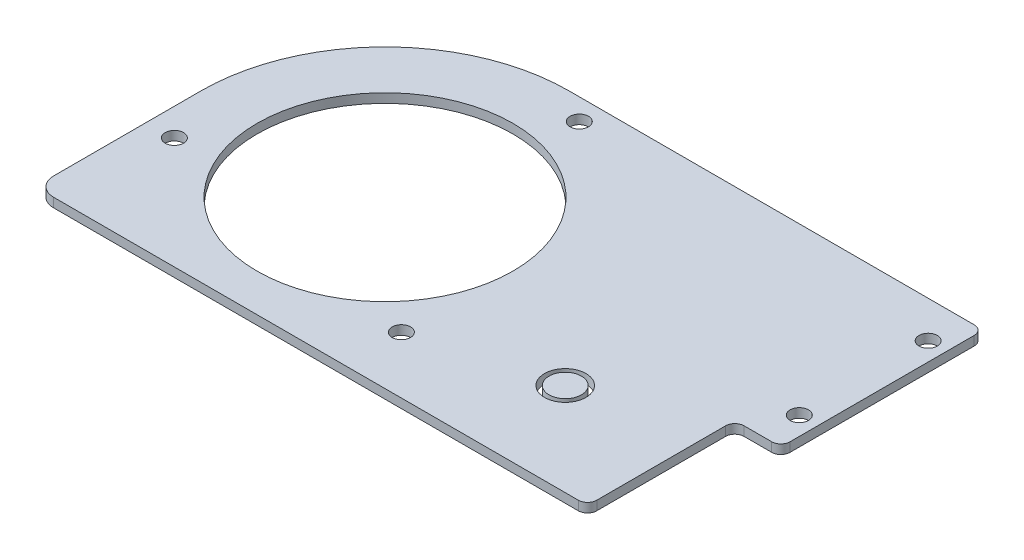
ISO-10303-21;
HEADER;
FILE_DESCRIPTION(('STEP AP214'),'2;1');
FILE_NAME('part.step','',(''),(''),'','','');
FILE_SCHEMA(('AUTOMOTIVE_DESIGN { 1 0 10303 214 1 1 1 1 }'));
ENDSEC;
DATA;
#1=APPLICATION_CONTEXT('core data for automotive mechanical design processes');
#2=APPLICATION_PROTOCOL_DEFINITION('international standard','automotive_design',2000,#1);
#3=PRODUCT_CONTEXT('',#1,'mechanical');
#4=PRODUCT('Part','Part','',(#3));
#5=PRODUCT_RELATED_PRODUCT_CATEGORY('part','',(#4));
#6=PRODUCT_DEFINITION_FORMATION('','',#4);
#7=PRODUCT_DEFINITION_CONTEXT('part definition',#1,'design');
#8=PRODUCT_DEFINITION('design','',#6,#7);
#9=PRODUCT_DEFINITION_SHAPE('','',#8);
#10=(LENGTH_UNIT() NAMED_UNIT(*) SI_UNIT(.MILLI.,.METRE.));
#11=(NAMED_UNIT(*) PLANE_ANGLE_UNIT() SI_UNIT($,.RADIAN.));
#12=(NAMED_UNIT(*) SI_UNIT($,.STERADIAN.) SOLID_ANGLE_UNIT());
#13=UNCERTAINTY_MEASURE_WITH_UNIT(LENGTH_MEASURE(1.E-05),#10,'distance_accuracy_value','');
#14=(GEOMETRIC_REPRESENTATION_CONTEXT(3) GLOBAL_UNCERTAINTY_ASSIGNED_CONTEXT((#13)) GLOBAL_UNIT_ASSIGNED_CONTEXT((#10,
#11,#12)) REPRESENTATION_CONTEXT('',''));
#15=CARTESIAN_POINT('',(0.,0.,0.));
#16=DIRECTION('',(0.,0.,1.));
#17=DIRECTION('',(1.,0.,0.));
#18=AXIS2_PLACEMENT_3D('',#15,#16,#17);
#19=CARTESIAN_POINT('',(-114.3,6.35,101.6));
#20=DIRECTION('',(0.,-1.,0.));
#21=DIRECTION('',(0.,0.,-1.));
#22=AXIS2_PLACEMENT_3D('',#19,#20,#21);
#23=PLANE('',#22);
#24=CARTESIAN_POINT('',(21.8094681715398,6.35,-112.199987068068));
#25=DIRECTION('',(0.,1.,0.));
#26=DIRECTION('',(0.,0.,1.));
#27=AXIS2_PLACEMENT_3D('',#24,#25,#26);
#28=CIRCLE('',#27,6.34999999999998);
#29=CARTESIAN_POINT('',(21.8094681715398,6.35,-105.849987068068));
#30=VERTEX_POINT('',#29);
#31=EDGE_CURVE('E191',#30,#30,#28,.T.);
#32=ORIENTED_EDGE('',*,*,#31,.F.);
#33=EDGE_LOOP('',(#32));
#34=FACE_BOUND('',#33,.T.);
#35=CARTESIAN_POINT('',(273.05,6.35,-101.6));
#36=DIRECTION('',(0.,1.,0.));
#37=DIRECTION('',(0.,0.,1.));
#38=AXIS2_PLACEMENT_3D('',#35,#36,#37);
#39=CIRCLE('',#38,6.35);
#40=CARTESIAN_POINT('',(273.05,6.35,-95.2500000000001));
#41=VERTEX_POINT('',#40);
#42=EDGE_CURVE('E179',#41,#41,#39,.T.);
#43=ORIENTED_EDGE('',*,*,#42,.F.);
#44=EDGE_LOOP('',(#43));
#45=FACE_BOUND('',#44,.T.);
#46=CARTESIAN_POINT('',(0.,6.35,0.));
#47=DIRECTION('',(0.,1.,0.));
#48=DIRECTION('',(0.,0.,1.));
#49=AXIS2_PLACEMENT_3D('',#46,#47,#48);
#50=CIRCLE('',#49,88.265);
#51=CARTESIAN_POINT('',(0.,6.35,88.265));
#52=VERTEX_POINT('',#51);
#53=EDGE_CURVE('E169',#52,#52,#50,.T.);
#54=ORIENTED_EDGE('',*,*,#53,.F.);
#55=EDGE_LOOP('',(#54));
#56=FACE_BOUND('',#55,.T.);
#57=CARTESIAN_POINT('',(-114.3,6.35,101.6));
#58=DIRECTION('',(0.,1.,0.));
#59=DIRECTION('',(0.,0.,-1.));
#60=AXIS2_PLACEMENT_3D('',#57,#58,#59);
#61=CIRCLE('',#60,12.7);
#62=CARTESIAN_POINT('',(-127.,6.35,101.6));
#63=VERTEX_POINT('',#62);
#64=CARTESIAN_POINT('',(-114.3,6.35,114.3));
#65=VERTEX_POINT('',#64);
#66=EDGE_CURVE('E139',#63,#65,#61,.T.);
#67=ORIENTED_EDGE('',*,*,#66,.T.);
#68=DIRECTION('',(1.,0.,0.));
#69=VECTOR('',#68,1.);
#70=CARTESIAN_POINT('',(247.65,6.35,114.3));
#71=LINE('',#70,#69);
#72=CARTESIAN_POINT('',(247.65,6.35,114.3));
#73=VERTEX_POINT('',#72);
#74=EDGE_CURVE('E132',#65,#73,#71,.T.);
#75=ORIENTED_EDGE('',*,*,#74,.T.);
#76=CARTESIAN_POINT('',(247.65,6.35,107.95));
#77=DIRECTION('',(0.,1.,0.));
#78=DIRECTION('',(0.,0.,1.));
#79=AXIS2_PLACEMENT_3D('',#76,#77,#78);
#80=CIRCLE('',#79,6.35000000000003);
#81=CARTESIAN_POINT('',(254.,6.35,107.95));
#82=VERTEX_POINT('',#81);
#83=EDGE_CURVE('E136',#73,#82,#80,.T.);
#84=ORIENTED_EDGE('',*,*,#83,.T.);
#85=DIRECTION('',(0.,0.,-1.));
#86=VECTOR('',#85,1.);
#87=CARTESIAN_POINT('',(254.,6.35,107.95));
#88=LINE('',#87,#86);
#89=CARTESIAN_POINT('',(254.,6.35,19.05));
#90=VERTEX_POINT('',#89);
#91=EDGE_CURVE('E157',#82,#90,#88,.T.);
#92=ORIENTED_EDGE('',*,*,#91,.T.);
#93=CARTESIAN_POINT('',(260.35,6.35,19.05));
#94=DIRECTION('',(0.,-1.,0.));
#95=DIRECTION('',(0.,0.,1.));
#96=AXIS2_PLACEMENT_3D('',#93,#94,#95);
#97=CIRCLE('',#96,6.35000000000001);
#98=CARTESIAN_POINT('',(260.35,6.35,12.7));
#99=VERTEX_POINT('',#98);
#100=EDGE_CURVE('E159',#90,#99,#97,.T.);
#101=ORIENTED_EDGE('',*,*,#100,.T.);
#102=DIRECTION('',(1.,0.,0.));
#103=VECTOR('',#102,1.);
#104=CARTESIAN_POINT('',(260.35,6.35,12.7));
#105=LINE('',#104,#103);
#106=CARTESIAN_POINT('',(279.4,6.35,12.7));
#107=VERTEX_POINT('',#106);
#108=EDGE_CURVE('E265',#99,#107,#105,.T.);
#109=ORIENTED_EDGE('',*,*,#108,.T.);
#110=CARTESIAN_POINT('',(279.4,6.35,6.35));
#111=DIRECTION('',(0.,1.,0.));
#112=DIRECTION('',(0.,0.,-1.));
#113=AXIS2_PLACEMENT_3D('',#110,#111,#112);
#114=CIRCLE('',#113,6.35000000000001);
#115=CARTESIAN_POINT('',(285.75,6.35,6.34999999999996));
#116=VERTEX_POINT('',#115);
#117=EDGE_CURVE('E263',#107,#116,#114,.T.);
#118=ORIENTED_EDGE('',*,*,#117,.T.);
#119=DIRECTION('',(0.,0.,-1.));
#120=VECTOR('',#119,1.);
#121=CARTESIAN_POINT('',(285.75,6.35,-120.65));
#122=LINE('',#121,#120);
#123=CARTESIAN_POINT('',(285.75,6.35,-120.65));
#124=VERTEX_POINT('',#123);
#125=EDGE_CURVE('E261',#116,#124,#122,.T.);
#126=ORIENTED_EDGE('',*,*,#125,.T.);
#127=CARTESIAN_POINT('',(279.4,6.35,-120.65));
#128=DIRECTION('',(0.,1.,0.));
#129=DIRECTION('',(0.,0.,-1.));
#130=AXIS2_PLACEMENT_3D('',#127,#128,#129);
#131=CIRCLE('',#130,6.35000000000001);
#132=CARTESIAN_POINT('',(279.4,6.35,-127.));
#133=VERTEX_POINT('',#132);
#134=EDGE_CURVE('E259',#124,#133,#131,.T.);
#135=ORIENTED_EDGE('',*,*,#134,.T.);
#136=DIRECTION('',(-1.,0.,0.));
#137=VECTOR('',#136,1.);
#138=CARTESIAN_POINT('',(279.4,6.35,-127.));
#139=LINE('',#138,#137);
#140=CARTESIAN_POINT('',(0.,6.35,-127.));
#141=VERTEX_POINT('',#140);
#142=EDGE_CURVE('E257',#133,#141,#139,.T.);
#143=ORIENTED_EDGE('',*,*,#142,.T.);
#144=CARTESIAN_POINT('',(0.,6.35,0.));
#145=DIRECTION('',(0.,1.,0.));
#146=DIRECTION('',(0.,0.,-1.));
#147=AXIS2_PLACEMENT_3D('',#144,#145,#146);
#148=CIRCLE('',#147,127.);
#149=CARTESIAN_POINT('',(-127.,6.35,0.));
#150=VERTEX_POINT('',#149);
#151=EDGE_CURVE('E255',#141,#150,#148,.T.);
#152=ORIENTED_EDGE('',*,*,#151,.T.);
#153=DIRECTION('',(0.,0.,1.));
#154=VECTOR('',#153,1.);
#155=CARTESIAN_POINT('',(-127.,6.35,0.));
#156=LINE('',#155,#154);
#157=EDGE_CURVE('E194',#150,#63,#156,.T.);
#158=ORIENTED_EDGE('',*,*,#157,.T.);
#159=EDGE_LOOP('',(#67,#75,#84,#92,#101,#109,#118,#126,#135,#143,#152,#158));
#160=FACE_BOUND('',#159,.T.);
#161=CARTESIAN_POINT('',(-108.072773191002,6.35,37.2124400544523));
#162=DIRECTION('',(0.,1.,0.));
#163=DIRECTION('',(0.,0.,1.));
#164=AXIS2_PLACEMENT_3D('',#161,#162,#163);
#165=CIRCLE('',#164,6.35);
#166=CARTESIAN_POINT('',(-108.072773191002,6.35,43.5624400544523));
#167=VERTEX_POINT('',#166);
#168=EDGE_CURVE('E172',#167,#167,#165,.T.);
#169=ORIENTED_EDGE('',*,*,#168,.F.);
#170=EDGE_LOOP('',(#169));
#171=FACE_BOUND('',#170,.T.);
#172=CARTESIAN_POINT('',(273.05,6.35,-12.7));
#173=DIRECTION('',(0.,1.,0.));
#174=DIRECTION('',(0.,0.,1.));
#175=AXIS2_PLACEMENT_3D('',#172,#173,#174);
#176=CIRCLE('',#175,6.35);
#177=CARTESIAN_POINT('',(273.05,6.35,-6.35));
#178=VERTEX_POINT('',#177);
#179=EDGE_CURVE('E185',#178,#178,#176,.T.);
#180=ORIENTED_EDGE('',*,*,#179,.F.);
#181=EDGE_LOOP('',(#180));
#182=FACE_BOUND('',#181,.T.);
#183=CARTESIAN_POINT('',(86.2633050194624,6.35,74.9875470136155));
#184=DIRECTION('',(0.,1.,0.));
#185=DIRECTION('',(0.,0.,1.));
#186=AXIS2_PLACEMENT_3D('',#183,#184,#185);
#187=CIRCLE('',#186,6.34999999999999);
#188=CARTESIAN_POINT('',(86.2633050194624,6.35,81.3375470136155));
#189=VERTEX_POINT('',#188);
#190=EDGE_CURVE('E55',#189,#189,#187,.T.);
#191=ORIENTED_EDGE('',*,*,#190,.F.);
#192=EDGE_LOOP('',(#191));
#193=FACE_BOUND('',#192,.T.);
#194=CARTESIAN_POINT('',(174.614839999995,6.35,50.2919999999997));
#195=DIRECTION('',(0.,-1.,0.));
#196=DIRECTION('',(0.,0.,-1.));
#197=AXIS2_PLACEMENT_3D('',#194,#195,#196);
#198=CIRCLE('',#197,14.2875);
#199=CARTESIAN_POINT('',(174.614839999995,6.35,36.0044999999997));
#200=VERTEX_POINT('',#199);
#201=EDGE_CURVE('E12',#200,#200,#198,.F.);
#202=ORIENTED_EDGE('',*,*,#201,.F.);
#203=EDGE_LOOP('',(#202));
#204=FACE_BOUND('',#203,.T.);
#205=ADVANCED_FACE('F46',(#34,#45,#56,#160,#171,#182,#193,#204),#23,.F.);
#206=CARTESIAN_POINT('',(-114.3,0.,101.6));
#207=DIRECTION('',(0.,-1.,0.));
#208=DIRECTION('',(0.,0.,-1.));
#209=AXIS2_PLACEMENT_3D('',#206,#207,#208);
#210=PLANE('',#209);
#211=CARTESIAN_POINT('',(21.8094681715398,0.,-112.199987068068));
#212=DIRECTION('',(0.,1.,0.));
#213=DIRECTION('',(0.,0.,1.));
#214=AXIS2_PLACEMENT_3D('',#211,#212,#213);
#215=CIRCLE('',#214,6.34999999999998);
#216=CARTESIAN_POINT('',(21.8094681715398,0.,-105.849987068068));
#217=VERTEX_POINT('',#216);
#218=EDGE_CURVE('E182',#217,#217,#215,.T.);
#219=ORIENTED_EDGE('',*,*,#218,.T.);
#220=EDGE_LOOP('',(#219));
#221=FACE_BOUND('',#220,.T.);
#222=CARTESIAN_POINT('',(273.05,0.,-101.6));
#223=DIRECTION('',(0.,1.,0.));
#224=DIRECTION('',(0.,0.,1.));
#225=AXIS2_PLACEMENT_3D('',#222,#223,#224);
#226=CIRCLE('',#225,6.35);
#227=CARTESIAN_POINT('',(273.05,0.,-95.2500000000001));
#228=VERTEX_POINT('',#227);
#229=EDGE_CURVE('E168',#228,#228,#226,.T.);
#230=ORIENTED_EDGE('',*,*,#229,.T.);
#231=EDGE_LOOP('',(#230));
#232=FACE_BOUND('',#231,.T.);
#233=CARTESIAN_POINT('',(0.,0.,0.));
#234=DIRECTION('',(0.,1.,0.));
#235=DIRECTION('',(0.,0.,1.));
#236=AXIS2_PLACEMENT_3D('',#233,#234,#235);
#237=CIRCLE('',#236,88.265);
#238=CARTESIAN_POINT('',(0.,0.,88.265));
#239=VERTEX_POINT('',#238);
#240=EDGE_CURVE('E164',#239,#239,#237,.T.);
#241=ORIENTED_EDGE('',*,*,#240,.T.);
#242=EDGE_LOOP('',(#241));
#243=FACE_BOUND('',#242,.T.);
#244=CARTESIAN_POINT('',(-114.3,0.,101.6));
#245=DIRECTION('',(0.,1.,0.));
#246=DIRECTION('',(0.,0.,-1.));
#247=AXIS2_PLACEMENT_3D('',#244,#245,#246);
#248=CIRCLE('',#247,12.7);
#249=CARTESIAN_POINT('',(-127.,0.,101.6));
#250=VERTEX_POINT('',#249);
#251=CARTESIAN_POINT('',(-114.3,0.,114.3));
#252=VERTEX_POINT('',#251);
#253=EDGE_CURVE('E240',#250,#252,#248,.T.);
#254=ORIENTED_EDGE('',*,*,#253,.F.);
#255=DIRECTION('',(0.,0.,1.));
#256=VECTOR('',#255,1.);
#257=CARTESIAN_POINT('',(-127.,0.,0.));
#258=LINE('',#257,#256);
#259=CARTESIAN_POINT('',(-127.,0.,0.));
#260=VERTEX_POINT('',#259);
#261=EDGE_CURVE('E63',#260,#250,#258,.T.);
#262=ORIENTED_EDGE('',*,*,#261,.F.);
#263=CARTESIAN_POINT('',(0.,0.,0.));
#264=DIRECTION('',(0.,1.,0.));
#265=DIRECTION('',(0.,0.,-1.));
#266=AXIS2_PLACEMENT_3D('',#263,#264,#265);
#267=CIRCLE('',#266,127.);
#268=CARTESIAN_POINT('',(0.,0.,-127.));
#269=VERTEX_POINT('',#268);
#270=EDGE_CURVE('E315',#269,#260,#267,.T.);
#271=ORIENTED_EDGE('',*,*,#270,.F.);
#272=DIRECTION('',(-1.,0.,0.));
#273=VECTOR('',#272,1.);
#274=CARTESIAN_POINT('',(279.4,0.,-127.));
#275=LINE('',#274,#273);
#276=CARTESIAN_POINT('',(279.4,0.,-127.));
#277=VERTEX_POINT('',#276);
#278=EDGE_CURVE('E306',#277,#269,#275,.T.);
#279=ORIENTED_EDGE('',*,*,#278,.F.);
#280=CARTESIAN_POINT('',(279.4,0.,-120.65));
#281=DIRECTION('',(0.,1.,0.));
#282=DIRECTION('',(0.,0.,-1.));
#283=AXIS2_PLACEMENT_3D('',#280,#281,#282);
#284=CIRCLE('',#283,6.35000000000001);
#285=CARTESIAN_POINT('',(285.75,0.,-120.65));
#286=VERTEX_POINT('',#285);
#287=EDGE_CURVE('E307',#286,#277,#284,.T.);
#288=ORIENTED_EDGE('',*,*,#287,.F.);
#289=DIRECTION('',(0.,0.,-1.));
#290=VECTOR('',#289,1.);
#291=CARTESIAN_POINT('',(285.75,0.,-120.65));
#292=LINE('',#291,#290);
#293=CARTESIAN_POINT('',(285.75,0.,6.34999999999996));
#294=VERTEX_POINT('',#293);
#295=EDGE_CURVE('E289',#294,#286,#292,.T.);
#296=ORIENTED_EDGE('',*,*,#295,.F.);
#297=CARTESIAN_POINT('',(279.4,0.,6.35));
#298=DIRECTION('',(0.,1.,0.));
#299=DIRECTION('',(0.,0.,-1.));
#300=AXIS2_PLACEMENT_3D('',#297,#298,#299);
#301=CIRCLE('',#300,6.35000000000001);
#302=CARTESIAN_POINT('',(279.4,0.,12.7));
#303=VERTEX_POINT('',#302);
#304=EDGE_CURVE('E280',#303,#294,#301,.T.);
#305=ORIENTED_EDGE('',*,*,#304,.F.);
#306=DIRECTION('',(1.,0.,0.));
#307=VECTOR('',#306,1.);
#308=CARTESIAN_POINT('',(260.35,0.,12.7));
#309=LINE('',#308,#307);
#310=CARTESIAN_POINT('',(260.35,0.,12.7));
#311=VERTEX_POINT('',#310);
#312=EDGE_CURVE('E281',#311,#303,#309,.T.);
#313=ORIENTED_EDGE('',*,*,#312,.F.);
#314=CARTESIAN_POINT('',(260.35,0.,19.05));
#315=DIRECTION('',(0.,-1.,0.));
#316=DIRECTION('',(0.,0.,1.));
#317=AXIS2_PLACEMENT_3D('',#314,#315,#316);
#318=CIRCLE('',#317,6.35000000000001);
#319=CARTESIAN_POINT('',(254.,0.,19.05));
#320=VERTEX_POINT('',#319);
#321=EDGE_CURVE('E277',#320,#311,#318,.T.);
#322=ORIENTED_EDGE('',*,*,#321,.F.);
#323=DIRECTION('',(0.,0.,-1.));
#324=VECTOR('',#323,1.);
#325=CARTESIAN_POINT('',(254.,0.,107.95));
#326=LINE('',#325,#324);
#327=CARTESIAN_POINT('',(254.,0.,107.95));
#328=VERTEX_POINT('',#327);
#329=EDGE_CURVE('E150',#328,#320,#326,.T.);
#330=ORIENTED_EDGE('',*,*,#329,.F.);
#331=CARTESIAN_POINT('',(247.65,0.,107.95));
#332=DIRECTION('',(0.,1.,0.));
#333=DIRECTION('',(0.,0.,1.));
#334=AXIS2_PLACEMENT_3D('',#331,#332,#333);
#335=CIRCLE('',#334,6.35000000000003);
#336=CARTESIAN_POINT('',(247.65,0.,114.3));
#337=VERTEX_POINT('',#336);
#338=EDGE_CURVE('E151',#337,#328,#335,.T.);
#339=ORIENTED_EDGE('',*,*,#338,.F.);
#340=DIRECTION('',(1.,0.,0.));
#341=VECTOR('',#340,1.);
#342=CARTESIAN_POINT('',(247.65,0.,114.3));
#343=LINE('',#342,#341);
#344=EDGE_CURVE('E147',#252,#337,#343,.T.);
#345=ORIENTED_EDGE('',*,*,#344,.F.);
#346=EDGE_LOOP('',(#254,#262,#271,#279,#288,#296,#305,#313,#322,#330,#339,#345));
#347=FACE_BOUND('',#346,.T.);
#348=CARTESIAN_POINT('',(-108.072773191002,0.,37.2124400544523));
#349=DIRECTION('',(0.,1.,0.));
#350=DIRECTION('',(0.,0.,1.));
#351=AXIS2_PLACEMENT_3D('',#348,#349,#350);
#352=CIRCLE('',#351,6.35);
#353=CARTESIAN_POINT('',(-108.072773191002,0.,43.5624400544523));
#354=VERTEX_POINT('',#353);
#355=EDGE_CURVE('E167',#354,#354,#352,.T.);
#356=ORIENTED_EDGE('',*,*,#355,.T.);
#357=EDGE_LOOP('',(#356));
#358=FACE_BOUND('',#357,.T.);
#359=CARTESIAN_POINT('',(273.05,0.,-12.7));
#360=DIRECTION('',(0.,1.,0.));
#361=DIRECTION('',(0.,0.,1.));
#362=AXIS2_PLACEMENT_3D('',#359,#360,#361);
#363=CIRCLE('',#362,6.35);
#364=CARTESIAN_POINT('',(273.05,0.,-6.35));
#365=VERTEX_POINT('',#364);
#366=EDGE_CURVE('E176',#365,#365,#363,.T.);
#367=ORIENTED_EDGE('',*,*,#366,.T.);
#368=EDGE_LOOP('',(#367));
#369=FACE_BOUND('',#368,.T.);
#370=CARTESIAN_POINT('',(86.2633050194624,0.,74.9875470136155));
#371=DIRECTION('',(0.,1.,0.));
#372=DIRECTION('',(0.,0.,1.));
#373=AXIS2_PLACEMENT_3D('',#370,#371,#372);
#374=CIRCLE('',#373,6.34999999999999);
#375=CARTESIAN_POINT('',(86.2633050194624,0.,81.3375470136155));
#376=VERTEX_POINT('',#375);
#377=EDGE_CURVE('E188',#376,#376,#374,.T.);
#378=ORIENTED_EDGE('',*,*,#377,.T.);
#379=EDGE_LOOP('',(#378));
#380=FACE_BOUND('',#379,.T.);
#381=CARTESIAN_POINT('',(174.614839999995,0.,50.2919999999997));
#382=DIRECTION('',(0.,1.,0.));
#383=DIRECTION('',(0.,0.,1.));
#384=AXIS2_PLACEMENT_3D('',#381,#382,#383);
#385=CIRCLE('',#384,14.2875);
#386=CARTESIAN_POINT('',(174.614839999995,0.,64.5794999999998));
#387=VERTEX_POINT('',#386);
#388=EDGE_CURVE('E49',#387,#387,#385,.T.);
#389=ORIENTED_EDGE('',*,*,#388,.T.);
#390=EDGE_LOOP('',(#389));
#391=FACE_BOUND('',#390,.T.);
#392=ADVANCED_FACE('F207',(#221,#232,#243,#347,#358,#369,#380,#391),#210,.T.);
#393=CARTESIAN_POINT('',(-114.3,6.35,101.6));
#394=DIRECTION('',(0.,-1.,0.));
#395=DIRECTION('',(0.,0.,-1.));
#396=AXIS2_PLACEMENT_3D('',#393,#394,#395);
#397=CYLINDRICAL_SURFACE('',#396,12.7);
#398=ORIENTED_EDGE('',*,*,#253,.T.);
#399=DIRECTION('',(0.,-1.,0.));
#400=VECTOR('',#399,1.);
#401=CARTESIAN_POINT('',(-114.3,6.35,114.3));
#402=LINE('',#401,#400);
#403=EDGE_CURVE('E329',#65,#252,#402,.T.);
#404=ORIENTED_EDGE('',*,*,#403,.F.);
#405=ORIENTED_EDGE('',*,*,#66,.F.);
#406=DIRECTION('',(0.,-1.,0.));
#407=VECTOR('',#406,1.);
#408=CARTESIAN_POINT('',(-127.,6.35,101.6));
#409=LINE('',#408,#407);
#410=EDGE_CURVE('E248',#63,#250,#409,.T.);
#411=ORIENTED_EDGE('',*,*,#410,.T.);
#412=EDGE_LOOP('',(#398,#404,#405,#411));
#413=FACE_BOUND('',#412,.T.);
#414=ADVANCED_FACE('F224',(#413),#397,.T.);
#415=CARTESIAN_POINT('',(247.65,6.35,114.3));
#416=DIRECTION('',(0.,0.,-1.));
#417=DIRECTION('',(-1.,0.,0.));
#418=AXIS2_PLACEMENT_3D('',#415,#416,#417);
#419=PLANE('',#418);
#420=ORIENTED_EDGE('',*,*,#344,.T.);
#421=DIRECTION('',(0.,-1.,0.));
#422=VECTOR('',#421,1.);
#423=CARTESIAN_POINT('',(247.65,6.35,114.3));
#424=LINE('',#423,#422);
#425=EDGE_CURVE('E145',#73,#337,#424,.T.);
#426=ORIENTED_EDGE('',*,*,#425,.F.);
#427=ORIENTED_EDGE('',*,*,#74,.F.);
#428=ORIENTED_EDGE('',*,*,#403,.T.);
#429=EDGE_LOOP('',(#420,#426,#427,#428));
#430=FACE_BOUND('',#429,.T.);
#431=ADVANCED_FACE('F146',(#430),#419,.F.);
#432=CARTESIAN_POINT('',(247.65,6.35,107.95));
#433=DIRECTION('',(0.,-1.,0.));
#434=DIRECTION('',(0.,0.,-1.));
#435=AXIS2_PLACEMENT_3D('',#432,#433,#434);
#436=CYLINDRICAL_SURFACE('',#435,6.35000000000003);
#437=ORIENTED_EDGE('',*,*,#338,.T.);
#438=DIRECTION('',(0.,-1.,0.));
#439=VECTOR('',#438,1.);
#440=CARTESIAN_POINT('',(254.,6.35,107.95));
#441=LINE('',#440,#439);
#442=EDGE_CURVE('E155',#82,#328,#441,.T.);
#443=ORIENTED_EDGE('',*,*,#442,.F.);
#444=ORIENTED_EDGE('',*,*,#83,.F.);
#445=ORIENTED_EDGE('',*,*,#425,.T.);
#446=EDGE_LOOP('',(#437,#443,#444,#445));
#447=FACE_BOUND('',#446,.T.);
#448=ADVANCED_FACE('F153',(#447),#436,.T.);
#449=CARTESIAN_POINT('',(254.,6.35,107.95));
#450=DIRECTION('',(-1.,0.,0.));
#451=DIRECTION('',(0.,0.,1.));
#452=AXIS2_PLACEMENT_3D('',#449,#450,#451);
#453=PLANE('',#452);
#454=ORIENTED_EDGE('',*,*,#329,.T.);
#455=DIRECTION('',(0.,-1.,0.));
#456=VECTOR('',#455,1.);
#457=CARTESIAN_POINT('',(254.,6.35,19.05));
#458=LINE('',#457,#456);
#459=EDGE_CURVE('E333',#90,#320,#458,.T.);
#460=ORIENTED_EDGE('',*,*,#459,.F.);
#461=ORIENTED_EDGE('',*,*,#91,.F.);
#462=ORIENTED_EDGE('',*,*,#442,.T.);
#463=EDGE_LOOP('',(#454,#460,#461,#462));
#464=FACE_BOUND('',#463,.T.);
#465=ADVANCED_FACE('F347',(#464),#453,.F.);
#466=CARTESIAN_POINT('',(260.35,6.35,19.05));
#467=DIRECTION('',(0.,-1.,0.));
#468=DIRECTION('',(0.,0.,-1.));
#469=AXIS2_PLACEMENT_3D('',#466,#467,#468);
#470=CYLINDRICAL_SURFACE('',#469,6.35000000000001);
#471=ORIENTED_EDGE('',*,*,#321,.T.);
#472=DIRECTION('',(0.,-1.,0.));
#473=VECTOR('',#472,1.);
#474=CARTESIAN_POINT('',(260.35,6.35,12.7));
#475=LINE('',#474,#473);
#476=EDGE_CURVE('E274',#99,#311,#475,.T.);
#477=ORIENTED_EDGE('',*,*,#476,.F.);
#478=ORIENTED_EDGE('',*,*,#100,.F.);
#479=ORIENTED_EDGE('',*,*,#459,.T.);
#480=EDGE_LOOP('',(#471,#477,#478,#479));
#481=FACE_BOUND('',#480,.T.);
#482=ADVANCED_FACE('F275',(#481),#470,.F.);
#483=CARTESIAN_POINT('',(260.35,6.35,12.7));
#484=DIRECTION('',(0.,0.,-1.));
#485=DIRECTION('',(-1.,0.,0.));
#486=AXIS2_PLACEMENT_3D('',#483,#484,#485);
#487=PLANE('',#486);
#488=ORIENTED_EDGE('',*,*,#312,.T.);
#489=DIRECTION('',(0.,-1.,0.));
#490=VECTOR('',#489,1.);
#491=CARTESIAN_POINT('',(279.4,6.35,12.7));
#492=LINE('',#491,#490);
#493=EDGE_CURVE('E285',#107,#303,#492,.T.);
#494=ORIENTED_EDGE('',*,*,#493,.F.);
#495=ORIENTED_EDGE('',*,*,#108,.F.);
#496=ORIENTED_EDGE('',*,*,#476,.T.);
#497=EDGE_LOOP('',(#488,#494,#495,#496));
#498=FACE_BOUND('',#497,.T.);
#499=ADVANCED_FACE('F283',(#498),#487,.F.);
#500=CARTESIAN_POINT('',(279.4,6.35,6.35));
#501=DIRECTION('',(0.,-1.,0.));
#502=DIRECTION('',(0.,0.,-1.));
#503=AXIS2_PLACEMENT_3D('',#500,#501,#502);
#504=CYLINDRICAL_SURFACE('',#503,6.35000000000001);
#505=ORIENTED_EDGE('',*,*,#304,.T.);
#506=DIRECTION('',(0.,-1.,0.));
#507=VECTOR('',#506,1.);
#508=CARTESIAN_POINT('',(285.75,6.35,6.34999999999996));
#509=LINE('',#508,#507);
#510=EDGE_CURVE('E294',#116,#294,#509,.T.);
#511=ORIENTED_EDGE('',*,*,#510,.F.);
#512=ORIENTED_EDGE('',*,*,#117,.F.);
#513=ORIENTED_EDGE('',*,*,#493,.T.);
#514=EDGE_LOOP('',(#505,#511,#512,#513));
#515=FACE_BOUND('',#514,.T.);
#516=ADVANCED_FACE('F292',(#515),#504,.T.);
#517=CARTESIAN_POINT('',(285.75,6.35,-120.65));
#518=DIRECTION('',(-1.,0.,0.));
#519=DIRECTION('',(0.,0.,1.));
#520=AXIS2_PLACEMENT_3D('',#517,#518,#519);
#521=PLANE('',#520);
#522=ORIENTED_EDGE('',*,*,#295,.T.);
#523=DIRECTION('',(0.,-1.,0.));
#524=VECTOR('',#523,1.);
#525=CARTESIAN_POINT('',(285.75,6.35,-120.65));
#526=LINE('',#525,#524);
#527=EDGE_CURVE('E301',#124,#286,#526,.T.);
#528=ORIENTED_EDGE('',*,*,#527,.F.);
#529=ORIENTED_EDGE('',*,*,#125,.F.);
#530=ORIENTED_EDGE('',*,*,#510,.T.);
#531=EDGE_LOOP('',(#522,#528,#529,#530));
#532=FACE_BOUND('',#531,.T.);
#533=ADVANCED_FACE('F302',(#532),#521,.F.);
#534=CARTESIAN_POINT('',(279.4,6.35,-120.65));
#535=DIRECTION('',(0.,-1.,0.));
#536=DIRECTION('',(0.,0.,-1.));
#537=AXIS2_PLACEMENT_3D('',#534,#535,#536);
#538=CYLINDRICAL_SURFACE('',#537,6.35000000000001);
#539=ORIENTED_EDGE('',*,*,#287,.T.);
#540=DIRECTION('',(0.,-1.,0.));
#541=VECTOR('',#540,1.);
#542=CARTESIAN_POINT('',(279.4,6.35,-127.));
#543=LINE('',#542,#541);
#544=EDGE_CURVE('E311',#133,#277,#543,.T.);
#545=ORIENTED_EDGE('',*,*,#544,.F.);
#546=ORIENTED_EDGE('',*,*,#134,.F.);
#547=ORIENTED_EDGE('',*,*,#527,.T.);
#548=EDGE_LOOP('',(#539,#545,#546,#547));
#549=FACE_BOUND('',#548,.T.);
#550=ADVANCED_FACE('F309',(#549),#538,.T.);
#551=CARTESIAN_POINT('',(279.4,6.35,-127.));
#552=DIRECTION('',(0.,0.,1.));
#553=DIRECTION('',(1.,0.,0.));
#554=AXIS2_PLACEMENT_3D('',#551,#552,#553);
#555=PLANE('',#554);
#556=ORIENTED_EDGE('',*,*,#278,.T.);
#557=DIRECTION('',(0.,-1.,0.));
#558=VECTOR('',#557,1.);
#559=CARTESIAN_POINT('',(0.,6.35,-127.));
#560=LINE('',#559,#558);
#561=EDGE_CURVE('E320',#141,#269,#560,.T.);
#562=ORIENTED_EDGE('',*,*,#561,.F.);
#563=ORIENTED_EDGE('',*,*,#142,.F.);
#564=ORIENTED_EDGE('',*,*,#544,.T.);
#565=EDGE_LOOP('',(#556,#562,#563,#564));
#566=FACE_BOUND('',#565,.T.);
#567=ADVANCED_FACE('F318',(#566),#555,.F.);
#568=CARTESIAN_POINT('',(0.,6.35,0.));
#569=DIRECTION('',(0.,-1.,0.));
#570=DIRECTION('',(0.,0.,-1.));
#571=AXIS2_PLACEMENT_3D('',#568,#569,#570);
#572=CYLINDRICAL_SURFACE('',#571,127.);
#573=ORIENTED_EDGE('',*,*,#270,.T.);
#574=DIRECTION('',(0.,-1.,0.));
#575=VECTOR('',#574,1.);
#576=CARTESIAN_POINT('',(-127.,6.35,0.));
#577=LINE('',#576,#575);
#578=EDGE_CURVE('E173',#150,#260,#577,.T.);
#579=ORIENTED_EDGE('',*,*,#578,.F.);
#580=ORIENTED_EDGE('',*,*,#151,.F.);
#581=ORIENTED_EDGE('',*,*,#561,.T.);
#582=EDGE_LOOP('',(#573,#579,#580,#581));
#583=FACE_BOUND('',#582,.T.);
#584=ADVANCED_FACE('F325',(#583),#572,.T.);
#585=CARTESIAN_POINT('',(-127.,6.35,0.));
#586=DIRECTION('',(1.,0.,0.));
#587=DIRECTION('',(0.,0.,-1.));
#588=AXIS2_PLACEMENT_3D('',#585,#586,#587);
#589=PLANE('',#588);
#590=ORIENTED_EDGE('',*,*,#261,.T.);
#591=ORIENTED_EDGE('',*,*,#410,.F.);
#592=ORIENTED_EDGE('',*,*,#157,.F.);
#593=ORIENTED_EDGE('',*,*,#578,.T.);
#594=EDGE_LOOP('',(#590,#591,#592,#593));
#595=FACE_BOUND('',#594,.T.);
#596=ADVANCED_FACE('F328',(#595),#589,.F.);
#597=CARTESIAN_POINT('',(0.,6.35,0.));
#598=DIRECTION('',(0.,-1.,0.));
#599=DIRECTION('',(0.,0.,-1.));
#600=AXIS2_PLACEMENT_3D('',#597,#598,#599);
#601=CYLINDRICAL_SURFACE('',#600,88.265);
#602=ORIENTED_EDGE('',*,*,#53,.T.);
#603=EDGE_LOOP('',(#602));
#604=FACE_BOUND('',#603,.T.);
#605=ORIENTED_EDGE('',*,*,#240,.F.);
#606=EDGE_LOOP('',(#605));
#607=FACE_BOUND('',#606,.T.);
#608=ADVANCED_FACE('F372',(#604,#607),#601,.F.);
#609=CARTESIAN_POINT('',(-108.072773191002,6.35,37.2124400544523));
#610=DIRECTION('',(0.,-1.,0.));
#611=DIRECTION('',(0.,0.,-1.));
#612=AXIS2_PLACEMENT_3D('',#609,#610,#611);
#613=CYLINDRICAL_SURFACE('',#612,6.35);
#614=ORIENTED_EDGE('',*,*,#168,.T.);
#615=EDGE_LOOP('',(#614));
#616=FACE_BOUND('',#615,.T.);
#617=ORIENTED_EDGE('',*,*,#355,.F.);
#618=EDGE_LOOP('',(#617));
#619=FACE_BOUND('',#618,.T.);
#620=ADVANCED_FACE('F375',(#616,#619),#613,.F.);
#621=CARTESIAN_POINT('',(273.05,6.35,-101.6));
#622=DIRECTION('',(0.,-1.,0.));
#623=DIRECTION('',(0.,0.,-1.));
#624=AXIS2_PLACEMENT_3D('',#621,#622,#623);
#625=CYLINDRICAL_SURFACE('',#624,6.35);
#626=ORIENTED_EDGE('',*,*,#42,.T.);
#627=EDGE_LOOP('',(#626));
#628=FACE_BOUND('',#627,.T.);
#629=ORIENTED_EDGE('',*,*,#229,.F.);
#630=EDGE_LOOP('',(#629));
#631=FACE_BOUND('',#630,.T.);
#632=ADVANCED_FACE('F379',(#628,#631),#625,.F.);
#633=CARTESIAN_POINT('',(273.05,6.35,-12.7));
#634=DIRECTION('',(0.,-1.,0.));
#635=DIRECTION('',(0.,0.,-1.));
#636=AXIS2_PLACEMENT_3D('',#633,#634,#635);
#637=CYLINDRICAL_SURFACE('',#636,6.35);
#638=ORIENTED_EDGE('',*,*,#179,.T.);
#639=EDGE_LOOP('',(#638));
#640=FACE_BOUND('',#639,.T.);
#641=ORIENTED_EDGE('',*,*,#366,.F.);
#642=EDGE_LOOP('',(#641));
#643=FACE_BOUND('',#642,.T.);
#644=ADVANCED_FACE('F383',(#640,#643),#637,.F.);
#645=CARTESIAN_POINT('',(21.8094681715398,6.35,-112.199987068068));
#646=DIRECTION('',(0.,-1.,0.));
#647=DIRECTION('',(0.,0.,-1.));
#648=AXIS2_PLACEMENT_3D('',#645,#646,#647);
#649=CYLINDRICAL_SURFACE('',#648,6.34999999999998);
#650=ORIENTED_EDGE('',*,*,#31,.T.);
#651=EDGE_LOOP('',(#650));
#652=FACE_BOUND('',#651,.T.);
#653=ORIENTED_EDGE('',*,*,#218,.F.);
#654=EDGE_LOOP('',(#653));
#655=FACE_BOUND('',#654,.T.);
#656=ADVANCED_FACE('F219',(#652,#655),#649,.F.);
#657=CARTESIAN_POINT('',(86.2633050194624,6.35,74.9875470136155));
#658=DIRECTION('',(0.,-1.,0.));
#659=DIRECTION('',(0.,0.,-1.));
#660=AXIS2_PLACEMENT_3D('',#657,#658,#659);
#661=CYLINDRICAL_SURFACE('',#660,6.34999999999999);
#662=ORIENTED_EDGE('',*,*,#190,.T.);
#663=EDGE_LOOP('',(#662));
#664=FACE_BOUND('',#663,.T.);
#665=ORIENTED_EDGE('',*,*,#377,.F.);
#666=EDGE_LOOP('',(#665));
#667=FACE_BOUND('',#666,.T.);
#668=ADVANCED_FACE('F202',(#664,#667),#661,.F.);
#669=CARTESIAN_POINT('',(174.614839999995,28.448,50.2919999999997));
#670=DIRECTION('',(0.,-1.,0.));
#671=DIRECTION('',(0.,0.,-1.));
#672=AXIS2_PLACEMENT_3D('',#669,#670,#671);
#673=CYLINDRICAL_SURFACE('',#672,14.2875);
#674=ORIENTED_EDGE('',*,*,#388,.F.);
#675=EDGE_LOOP('',(#674));
#676=FACE_BOUND('',#675,.T.);
#677=ORIENTED_EDGE('',*,*,#201,.T.);
#678=EDGE_LOOP('',(#677));
#679=FACE_BOUND('',#678,.T.);
#680=ADVANCED_FACE('F211',(#676,#679),#673,.F.);
#681=CLOSED_SHELL('',(#205,#392,#414,#431,#448,#465,#482,#499,#516,#533,#550,#567,#584,#596,
#608,#620,#632,#644,#656,#668,#680));
#682=MANIFOLD_SOLID_BREP('B2',#681);
#683=CARTESIAN_POINT('',(-114.3,0.,101.6));
#684=DIRECTION('',(0.,-1.,0.));
#685=DIRECTION('',(0.,0.,-1.));
#686=AXIS2_PLACEMENT_3D('',#683,#684,#685);
#687=PLANE('',#686);
#688=CARTESIAN_POINT('',(174.614839999995,0.,50.2919999999997));
#689=DIRECTION('',(0.,1.,0.));
#690=DIRECTION('',(0.,0.,1.));
#691=AXIS2_PLACEMENT_3D('',#688,#689,#690);
#692=CIRCLE('',#691,11.176);
#693=CARTESIAN_POINT('',(174.614839999995,0.,61.4679999999998));
#694=VERTEX_POINT('',#693);
#695=EDGE_CURVE('E531',#694,#694,#692,.T.);
#696=ORIENTED_EDGE('',*,*,#695,.F.);
#697=EDGE_LOOP('',(#696));
#698=FACE_BOUND('',#697,.T.);
#699=ADVANCED_FACE('F525',(#698),#687,.T.);
#700=CARTESIAN_POINT('',(174.614839999995,28.448,50.2919999999997));
#701=DIRECTION('',(0.,-1.,0.));
#702=DIRECTION('',(0.,0.,-1.));
#703=AXIS2_PLACEMENT_3D('',#700,#701,#702);
#704=CYLINDRICAL_SURFACE('',#703,11.176);
#705=ORIENTED_EDGE('',*,*,#695,.T.);
#706=EDGE_LOOP('',(#705));
#707=FACE_BOUND('',#706,.T.);
#708=CARTESIAN_POINT('',(174.614839999995,6.35,50.2919999999997));
#709=DIRECTION('',(0.,-1.,0.));
#710=DIRECTION('',(0.,0.,-1.));
#711=AXIS2_PLACEMENT_3D('',#708,#709,#710);
#712=CIRCLE('',#711,11.176);
#713=CARTESIAN_POINT('',(174.614839999995,6.35,39.1159999999997));
#714=VERTEX_POINT('',#713);
#715=EDGE_CURVE('E45',#714,#714,#712,.F.);
#716=ORIENTED_EDGE('',*,*,#715,.F.);
#717=EDGE_LOOP('',(#716));
#718=FACE_BOUND('',#717,.T.);
#719=ADVANCED_FACE('F537',(#707,#718),#704,.T.);
#720=CARTESIAN_POINT('',(-114.3,6.35,101.6));
#721=DIRECTION('',(0.,-1.,0.));
#722=DIRECTION('',(0.,0.,-1.));
#723=AXIS2_PLACEMENT_3D('',#720,#721,#722);
#724=PLANE('',#723);
#725=ORIENTED_EDGE('',*,*,#715,.T.);
#726=EDGE_LOOP('',(#725));
#727=FACE_BOUND('',#726,.T.);
#728=ADVANCED_FACE('F545',(#727),#724,.F.);
#729=CLOSED_SHELL('',(#699,#719,#728));
#730=MANIFOLD_SOLID_BREP('B6',#729);
#731=ADVANCED_BREP_SHAPE_REPRESENTATION('',(#18,#682,#730),#14);
#732=SHAPE_DEFINITION_REPRESENTATION(#9,#731);
ENDSEC;
END-ISO-10303-21;
